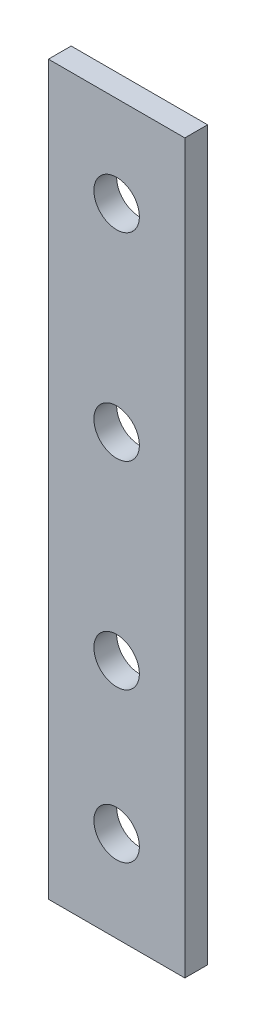
ISO-10303-21;
HEADER;
FILE_DESCRIPTION(('STEP AP214'),'2;1');
FILE_NAME('part.step','',(''),(''),'','','');
FILE_SCHEMA(('AUTOMOTIVE_DESIGN { 1 0 10303 214 1 1 1 1 }'));
ENDSEC;
DATA;
#1=APPLICATION_CONTEXT('core data for automotive mechanical design processes');
#2=APPLICATION_PROTOCOL_DEFINITION('international standard','automotive_design',2000,#1);
#3=PRODUCT_CONTEXT('',#1,'mechanical');
#4=PRODUCT('Part','Part','',(#3));
#5=PRODUCT_RELATED_PRODUCT_CATEGORY('part','',(#4));
#6=PRODUCT_DEFINITION_FORMATION('','',#4);
#7=PRODUCT_DEFINITION_CONTEXT('part definition',#1,'design');
#8=PRODUCT_DEFINITION('design','',#6,#7);
#9=PRODUCT_DEFINITION_SHAPE('','',#8);
#10=(LENGTH_UNIT() NAMED_UNIT(*) SI_UNIT(.MILLI.,.METRE.));
#11=(NAMED_UNIT(*) PLANE_ANGLE_UNIT() SI_UNIT($,.RADIAN.));
#12=(NAMED_UNIT(*) SI_UNIT($,.STERADIAN.) SOLID_ANGLE_UNIT());
#13=UNCERTAINTY_MEASURE_WITH_UNIT(LENGTH_MEASURE(1.E-05),#10,'distance_accuracy_value','');
#14=(GEOMETRIC_REPRESENTATION_CONTEXT(3) GLOBAL_UNCERTAINTY_ASSIGNED_CONTEXT((#13)) GLOBAL_UNIT_ASSIGNED_CONTEXT((#10,
#11,#12)) REPRESENTATION_CONTEXT('',''));
#15=CARTESIAN_POINT('',(0.,0.,0.));
#16=DIRECTION('',(0.,0.,1.));
#17=DIRECTION('',(1.,0.,0.));
#18=AXIS2_PLACEMENT_3D('',#15,#16,#17);
#19=CARTESIAN_POINT('',(0.,0.,3.175));
#20=DIRECTION('',(-1.,0.,0.));
#21=DIRECTION('',(0.,0.,1.));
#22=AXIS2_PLACEMENT_3D('',#19,#20,#21);
#23=PLANE('',#22);
#24=DIRECTION('',(0.,1.,0.));
#25=VECTOR('',#24,1.);
#26=CARTESIAN_POINT('',(0.,0.,0.));
#27=LINE('',#26,#25);
#28=CARTESIAN_POINT('',(0.,0.,0.));
#29=VERTEX_POINT('',#28);
#30=CARTESIAN_POINT('',(0.,101.6,0.));
#31=VERTEX_POINT('',#30);
#32=EDGE_CURVE('E115',#29,#31,#27,.T.);
#33=ORIENTED_EDGE('',*,*,#32,.F.);
#34=DIRECTION('',(0.,0.,-1.));
#35=VECTOR('',#34,1.);
#36=CARTESIAN_POINT('',(0.,0.,3.175));
#37=LINE('',#36,#35);
#38=CARTESIAN_POINT('',(0.,0.,3.175));
#39=VERTEX_POINT('',#38);
#40=EDGE_CURVE('E11',#39,#29,#37,.T.);
#41=ORIENTED_EDGE('',*,*,#40,.F.);
#42=DIRECTION('',(0.,1.,0.));
#43=VECTOR('',#42,1.);
#44=CARTESIAN_POINT('',(0.,0.,3.175));
#45=LINE('',#44,#43);
#46=CARTESIAN_POINT('',(0.,101.6,3.175));
#47=VERTEX_POINT('',#46);
#48=EDGE_CURVE('E95',#39,#47,#45,.T.);
#49=ORIENTED_EDGE('',*,*,#48,.T.);
#50=DIRECTION('',(0.,0.,-1.));
#51=VECTOR('',#50,1.);
#52=CARTESIAN_POINT('',(0.,101.6,3.175));
#53=LINE('',#52,#51);
#54=EDGE_CURVE('E55',#47,#31,#53,.T.);
#55=ORIENTED_EDGE('',*,*,#54,.T.);
#56=EDGE_LOOP('',(#33,#41,#49,#55));
#57=FACE_BOUND('',#56,.T.);
#58=ADVANCED_FACE('F38',(#57),#23,.T.);
#59=CARTESIAN_POINT('',(0.,0.,3.175));
#60=DIRECTION('',(0.,-1.,0.));
#61=DIRECTION('',(1.,0.,0.));
#62=AXIS2_PLACEMENT_3D('',#59,#60,#61);
#63=PLANE('',#62);
#64=DIRECTION('',(-1.,0.,0.));
#65=VECTOR('',#64,1.);
#66=CARTESIAN_POINT('',(0.,0.,0.));
#67=LINE('',#66,#65);
#68=CARTESIAN_POINT('',(19.05,0.,0.));
#69=VERTEX_POINT('',#68);
#70=EDGE_CURVE('E85',#69,#29,#67,.T.);
#71=ORIENTED_EDGE('',*,*,#70,.F.);
#72=DIRECTION('',(0.,0.,-1.));
#73=VECTOR('',#72,1.);
#74=CARTESIAN_POINT('',(19.05,0.,3.175));
#75=LINE('',#74,#73);
#76=CARTESIAN_POINT('',(19.05,0.,3.175));
#77=VERTEX_POINT('',#76);
#78=EDGE_CURVE('E47',#77,#69,#75,.T.);
#79=ORIENTED_EDGE('',*,*,#78,.F.);
#80=DIRECTION('',(-1.,0.,0.));
#81=VECTOR('',#80,1.);
#82=CARTESIAN_POINT('',(0.,0.,3.175));
#83=LINE('',#82,#81);
#84=EDGE_CURVE('E83',#77,#39,#83,.T.);
#85=ORIENTED_EDGE('',*,*,#84,.T.);
#86=ORIENTED_EDGE('',*,*,#40,.T.);
#87=EDGE_LOOP('',(#71,#79,#85,#86));
#88=FACE_BOUND('',#87,.T.);
#89=ADVANCED_FACE('F82',(#88),#63,.T.);
#90=CARTESIAN_POINT('',(19.05,0.,3.175));
#91=DIRECTION('',(1.,0.,0.));
#92=DIRECTION('',(0.,1.,0.));
#93=AXIS2_PLACEMENT_3D('',#90,#91,#92);
#94=PLANE('',#93);
#95=DIRECTION('',(0.,-1.,0.));
#96=VECTOR('',#95,1.);
#97=CARTESIAN_POINT('',(19.05,0.,0.));
#98=LINE('',#97,#96);
#99=CARTESIAN_POINT('',(19.05,101.6,0.));
#100=VERTEX_POINT('',#99);
#101=EDGE_CURVE('E118',#100,#69,#98,.T.);
#102=ORIENTED_EDGE('',*,*,#101,.F.);
#103=DIRECTION('',(0.,0.,-1.));
#104=VECTOR('',#103,1.);
#105=CARTESIAN_POINT('',(19.05,101.6,3.175));
#106=LINE('',#105,#104);
#107=CARTESIAN_POINT('',(19.05,101.6,3.175));
#108=VERTEX_POINT('',#107);
#109=EDGE_CURVE('E68',#108,#100,#106,.T.);
#110=ORIENTED_EDGE('',*,*,#109,.F.);
#111=DIRECTION('',(0.,-1.,0.));
#112=VECTOR('',#111,1.);
#113=CARTESIAN_POINT('',(19.05,0.,3.175));
#114=LINE('',#113,#112);
#115=EDGE_CURVE('E94',#108,#77,#114,.T.);
#116=ORIENTED_EDGE('',*,*,#115,.T.);
#117=ORIENTED_EDGE('',*,*,#78,.T.);
#118=EDGE_LOOP('',(#102,#110,#116,#117));
#119=FACE_BOUND('',#118,.T.);
#120=ADVANCED_FACE('F97',(#119),#94,.T.);
#121=CARTESIAN_POINT('',(9.52499999999999,33.6169,3.175));
#122=DIRECTION('',(0.,0.,-1.));
#123=DIRECTION('',(-1.,0.,0.));
#124=AXIS2_PLACEMENT_3D('',#121,#122,#123);
#125=CYLINDRICAL_SURFACE('',#124,3.175);
#126=CARTESIAN_POINT('',(9.52499999999999,33.6169,3.175));
#127=DIRECTION('',(0.,0.,1.));
#128=DIRECTION('',(1.,0.,0.));
#129=AXIS2_PLACEMENT_3D('',#126,#127,#128);
#130=CIRCLE('',#129,3.175);
#131=CARTESIAN_POINT('',(12.7,33.6169,3.175));
#132=VERTEX_POINT('',#131);
#133=EDGE_CURVE('E106',#132,#132,#130,.T.);
#134=ORIENTED_EDGE('',*,*,#133,.T.);
#135=EDGE_LOOP('',(#134));
#136=FACE_BOUND('',#135,.T.);
#137=CARTESIAN_POINT('',(9.52499999999999,33.6169,0.));
#138=DIRECTION('',(0.,0.,1.));
#139=DIRECTION('',(1.,0.,0.));
#140=AXIS2_PLACEMENT_3D('',#137,#138,#139);
#141=CIRCLE('',#140,3.175);
#142=CARTESIAN_POINT('',(12.7,33.6169,0.));
#143=VERTEX_POINT('',#142);
#144=EDGE_CURVE('E126',#143,#143,#141,.T.);
#145=ORIENTED_EDGE('',*,*,#144,.F.);
#146=EDGE_LOOP('',(#145));
#147=FACE_BOUND('',#146,.T.);
#148=ADVANCED_FACE('F149',(#136,#147),#125,.F.);
#149=CARTESIAN_POINT('',(9.52499999999999,61.25845,3.175));
#150=DIRECTION('',(0.,0.,-1.));
#151=DIRECTION('',(-1.,0.,0.));
#152=AXIS2_PLACEMENT_3D('',#149,#150,#151);
#153=CYLINDRICAL_SURFACE('',#152,3.175);
#154=CARTESIAN_POINT('',(9.52499999999999,61.25845,3.175));
#155=DIRECTION('',(0.,0.,1.));
#156=DIRECTION('',(1.,0.,0.));
#157=AXIS2_PLACEMENT_3D('',#154,#155,#156);
#158=CIRCLE('',#157,3.175);
#159=CARTESIAN_POINT('',(12.7,61.25845,3.175));
#160=VERTEX_POINT('',#159);
#161=EDGE_CURVE('E100',#160,#160,#158,.T.);
#162=ORIENTED_EDGE('',*,*,#161,.T.);
#163=EDGE_LOOP('',(#162));
#164=FACE_BOUND('',#163,.T.);
#165=CARTESIAN_POINT('',(9.52499999999999,61.25845,0.));
#166=DIRECTION('',(0.,0.,1.));
#167=DIRECTION('',(1.,0.,0.));
#168=AXIS2_PLACEMENT_3D('',#165,#166,#167);
#169=CIRCLE('',#168,3.175);
#170=CARTESIAN_POINT('',(12.7,61.25845,0.));
#171=VERTEX_POINT('',#170);
#172=EDGE_CURVE('E123',#171,#171,#169,.T.);
#173=ORIENTED_EDGE('',*,*,#172,.F.);
#174=EDGE_LOOP('',(#173));
#175=FACE_BOUND('',#174,.T.);
#176=ADVANCED_FACE('F142',(#164,#175),#153,.F.);
#177=CARTESIAN_POINT('',(0.,101.6,3.175));
#178=DIRECTION('',(0.,1.,0.));
#179=DIRECTION('',(0.,0.,1.));
#180=AXIS2_PLACEMENT_3D('',#177,#178,#179);
#181=PLANE('',#180);
#182=DIRECTION('',(1.,0.,0.));
#183=VECTOR('',#182,1.);
#184=CARTESIAN_POINT('',(0.,101.6,0.));
#185=LINE('',#184,#183);
#186=EDGE_CURVE('E120',#31,#100,#185,.T.);
#187=ORIENTED_EDGE('',*,*,#186,.F.);
#188=ORIENTED_EDGE('',*,*,#54,.F.);
#189=DIRECTION('',(1.,0.,0.));
#190=VECTOR('',#189,1.);
#191=CARTESIAN_POINT('',(0.,101.6,3.175));
#192=LINE('',#191,#190);
#193=EDGE_CURVE('E98',#47,#108,#192,.T.);
#194=ORIENTED_EDGE('',*,*,#193,.T.);
#195=ORIENTED_EDGE('',*,*,#109,.T.);
#196=EDGE_LOOP('',(#187,#188,#194,#195));
#197=FACE_BOUND('',#196,.T.);
#198=ADVANCED_FACE('F140',(#197),#181,.T.);
#199=CARTESIAN_POINT('',(9.525,12.7,3.175));
#200=DIRECTION('',(0.,0.,-1.));
#201=DIRECTION('',(-1.,0.,0.));
#202=AXIS2_PLACEMENT_3D('',#199,#200,#201);
#203=CYLINDRICAL_SURFACE('',#202,3.175);
#204=CARTESIAN_POINT('',(9.525,12.7,3.175));
#205=DIRECTION('',(0.,0.,1.));
#206=DIRECTION('',(1.,0.,0.));
#207=AXIS2_PLACEMENT_3D('',#204,#205,#206);
#208=CIRCLE('',#207,3.175);
#209=CARTESIAN_POINT('',(12.7,12.7,3.175));
#210=VERTEX_POINT('',#209);
#211=EDGE_CURVE('E132',#210,#210,#208,.T.);
#212=ORIENTED_EDGE('',*,*,#211,.T.);
#213=EDGE_LOOP('',(#212));
#214=FACE_BOUND('',#213,.T.);
#215=CARTESIAN_POINT('',(9.525,12.7,0.));
#216=DIRECTION('',(0.,0.,1.));
#217=DIRECTION('',(1.,0.,0.));
#218=AXIS2_PLACEMENT_3D('',#215,#216,#217);
#219=CIRCLE('',#218,3.175);
#220=CARTESIAN_POINT('',(12.7,12.7,0.));
#221=VERTEX_POINT('',#220);
#222=EDGE_CURVE('E112',#221,#221,#219,.T.);
#223=ORIENTED_EDGE('',*,*,#222,.F.);
#224=EDGE_LOOP('',(#223));
#225=FACE_BOUND('',#224,.T.);
#226=ADVANCED_FACE('F40',(#214,#225),#203,.F.);
#227=CARTESIAN_POINT('',(9.525,88.9,3.175));
#228=DIRECTION('',(0.,0.,-1.));
#229=DIRECTION('',(-1.,0.,0.));
#230=AXIS2_PLACEMENT_3D('',#227,#228,#229);
#231=CYLINDRICAL_SURFACE('',#230,3.175);
#232=CARTESIAN_POINT('',(9.525,88.9,3.175));
#233=DIRECTION('',(0.,0.,1.));
#234=DIRECTION('',(1.,0.,0.));
#235=AXIS2_PLACEMENT_3D('',#232,#233,#234);
#236=CIRCLE('',#235,3.175);
#237=CARTESIAN_POINT('',(12.7,88.9,3.175));
#238=VERTEX_POINT('',#237);
#239=EDGE_CURVE('E109',#238,#238,#236,.T.);
#240=ORIENTED_EDGE('',*,*,#239,.T.);
#241=EDGE_LOOP('',(#240));
#242=FACE_BOUND('',#241,.T.);
#243=CARTESIAN_POINT('',(9.525,88.9,0.));
#244=DIRECTION('',(0.,0.,1.));
#245=DIRECTION('',(1.,0.,0.));
#246=AXIS2_PLACEMENT_3D('',#243,#244,#245);
#247=CIRCLE('',#246,3.175);
#248=CARTESIAN_POINT('',(12.7,88.9,0.));
#249=VERTEX_POINT('',#248);
#250=EDGE_CURVE('E129',#249,#249,#247,.T.);
#251=ORIENTED_EDGE('',*,*,#250,.F.);
#252=EDGE_LOOP('',(#251));
#253=FACE_BOUND('',#252,.T.);
#254=ADVANCED_FACE('F148',(#242,#253),#231,.F.);
#255=CARTESIAN_POINT('',(0.,0.,3.175));
#256=DIRECTION('',(0.,0.,1.));
#257=DIRECTION('',(1.,0.,0.));
#258=AXIS2_PLACEMENT_3D('',#255,#256,#257);
#259=PLANE('',#258);
#260=ORIENTED_EDGE('',*,*,#211,.F.);
#261=EDGE_LOOP('',(#260));
#262=FACE_BOUND('',#261,.T.);
#263=ORIENTED_EDGE('',*,*,#48,.F.);
#264=ORIENTED_EDGE('',*,*,#84,.F.);
#265=ORIENTED_EDGE('',*,*,#115,.F.);
#266=ORIENTED_EDGE('',*,*,#193,.F.);
#267=EDGE_LOOP('',(#263,#264,#265,#266));
#268=FACE_BOUND('',#267,.T.);
#269=ORIENTED_EDGE('',*,*,#161,.F.);
#270=EDGE_LOOP('',(#269));
#271=FACE_BOUND('',#270,.T.);
#272=ORIENTED_EDGE('',*,*,#133,.F.);
#273=EDGE_LOOP('',(#272));
#274=FACE_BOUND('',#273,.T.);
#275=ORIENTED_EDGE('',*,*,#239,.F.);
#276=EDGE_LOOP('',(#275));
#277=FACE_BOUND('',#276,.T.);
#278=ADVANCED_FACE('F91',(#262,#268,#271,#274,#277),#259,.T.);
#279=CARTESIAN_POINT('',(0.,0.,0.));
#280=DIRECTION('',(0.,0.,1.));
#281=DIRECTION('',(1.,0.,0.));
#282=AXIS2_PLACEMENT_3D('',#279,#280,#281);
#283=PLANE('',#282);
#284=ORIENTED_EDGE('',*,*,#222,.T.);
#285=EDGE_LOOP('',(#284));
#286=FACE_BOUND('',#285,.T.);
#287=ORIENTED_EDGE('',*,*,#32,.T.);
#288=ORIENTED_EDGE('',*,*,#186,.T.);
#289=ORIENTED_EDGE('',*,*,#101,.T.);
#290=ORIENTED_EDGE('',*,*,#70,.T.);
#291=EDGE_LOOP('',(#287,#288,#289,#290));
#292=FACE_BOUND('',#291,.T.);
#293=ORIENTED_EDGE('',*,*,#172,.T.);
#294=EDGE_LOOP('',(#293));
#295=FACE_BOUND('',#294,.T.);
#296=ORIENTED_EDGE('',*,*,#144,.T.);
#297=EDGE_LOOP('',(#296));
#298=FACE_BOUND('',#297,.T.);
#299=ORIENTED_EDGE('',*,*,#250,.T.);
#300=EDGE_LOOP('',(#299));
#301=FACE_BOUND('',#300,.T.);
#302=ADVANCED_FACE('F171',(#286,#292,#295,#298,#301),#283,.F.);
#303=CLOSED_SHELL('',(#58,#89,#120,#148,#176,#198,#226,#254,#278,#302));
#304=MANIFOLD_SOLID_BREP('B2',#303);
#305=ADVANCED_BREP_SHAPE_REPRESENTATION('',(#18,#304),#14);
#306=SHAPE_DEFINITION_REPRESENTATION(#9,#305);
ENDSEC;
END-ISO-10303-21;
